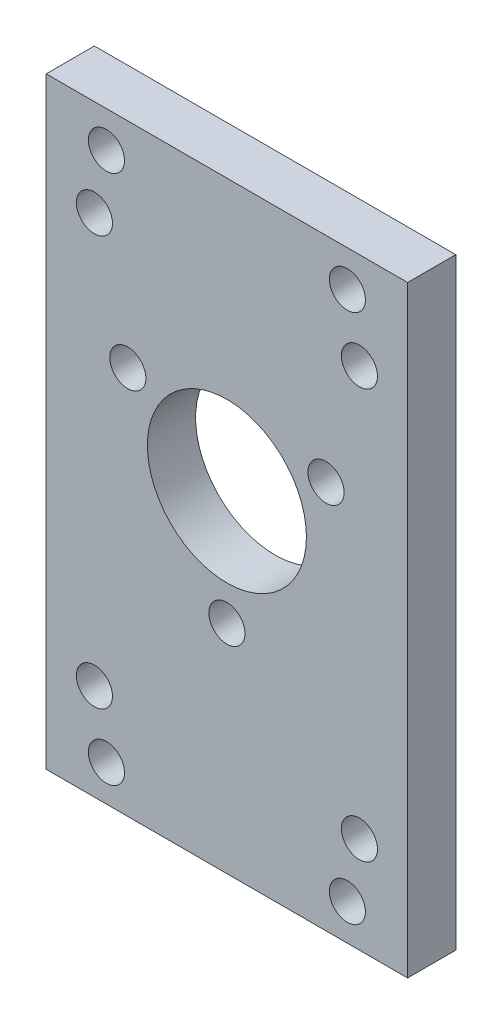
ISO-10303-21;
HEADER;
FILE_DESCRIPTION(('STEP AP214'),'2;1');
FILE_NAME('part.step','',(''),(''),'','','');
FILE_SCHEMA(('AUTOMOTIVE_DESIGN { 1 0 10303 214 1 1 1 1 }'));
ENDSEC;
DATA;
#1=APPLICATION_CONTEXT('core data for automotive mechanical design processes');
#2=APPLICATION_PROTOCOL_DEFINITION('international standard','automotive_design',2000,#1);
#3=PRODUCT_CONTEXT('',#1,'mechanical');
#4=PRODUCT('Part','Part','',(#3));
#5=PRODUCT_RELATED_PRODUCT_CATEGORY('part','',(#4));
#6=PRODUCT_DEFINITION_FORMATION('','',#4);
#7=PRODUCT_DEFINITION_CONTEXT('part definition',#1,'design');
#8=PRODUCT_DEFINITION('design','',#6,#7);
#9=PRODUCT_DEFINITION_SHAPE('','',#8);
#10=(LENGTH_UNIT() NAMED_UNIT(*) SI_UNIT(.MILLI.,.METRE.));
#11=(NAMED_UNIT(*) PLANE_ANGLE_UNIT() SI_UNIT($,.RADIAN.));
#12=(NAMED_UNIT(*) SI_UNIT($,.STERADIAN.) SOLID_ANGLE_UNIT());
#13=UNCERTAINTY_MEASURE_WITH_UNIT(LENGTH_MEASURE(1.E-05),#10,'distance_accuracy_value','');
#14=(GEOMETRIC_REPRESENTATION_CONTEXT(3) GLOBAL_UNCERTAINTY_ASSIGNED_CONTEXT((#13)) GLOBAL_UNIT_ASSIGNED_CONTEXT((#10,
#11,#12)) REPRESENTATION_CONTEXT('',''));
#15=CARTESIAN_POINT('',(0.,0.,0.));
#16=DIRECTION('',(0.,0.,1.));
#17=DIRECTION('',(1.,0.,0.));
#18=AXIS2_PLACEMENT_3D('',#15,#16,#17);
#19=CARTESIAN_POINT('',(0.,0.,4.));
#20=DIRECTION('',(0.,0.,-1.));
#21=DIRECTION('',(-1.,0.,0.));
#22=AXIS2_PLACEMENT_3D('',#19,#20,#21);
#23=PLANE('',#22);
#24=CARTESIAN_POINT('',(4.,42.,4.));
#25=DIRECTION('',(0.,0.,1.));
#26=DIRECTION('',(1.,0.,0.));
#27=AXIS2_PLACEMENT_3D('',#24,#25,#26);
#28=CIRCLE('',#27,1.5);
#29=CARTESIAN_POINT('',(5.5,42.,4.));
#30=VERTEX_POINT('',#29);
#31=EDGE_CURVE('E176',#30,#30,#28,.T.);
#32=ORIENTED_EDGE('',*,*,#31,.F.);
#33=EDGE_LOOP('',(#32));
#34=FACE_BOUND('',#33,.T.);
#35=CARTESIAN_POINT('',(26.,8.,4.));
#36=DIRECTION('',(0.,0.,1.));
#37=DIRECTION('',(1.,0.,0.));
#38=AXIS2_PLACEMENT_3D('',#35,#36,#37);
#39=CIRCLE('',#38,1.5);
#40=CARTESIAN_POINT('',(27.5,8.,4.));
#41=VERTEX_POINT('',#40);
#42=EDGE_CURVE('E169',#41,#41,#39,.T.);
#43=ORIENTED_EDGE('',*,*,#42,.F.);
#44=EDGE_LOOP('',(#43));
#45=FACE_BOUND('',#44,.T.);
#46=CARTESIAN_POINT('',(4.,8.,4.));
#47=DIRECTION('',(0.,0.,1.));
#48=DIRECTION('',(1.,0.,0.));
#49=AXIS2_PLACEMENT_3D('',#46,#47,#48);
#50=CIRCLE('',#49,1.5);
#51=CARTESIAN_POINT('',(5.50000000000001,8.,4.));
#52=VERTEX_POINT('',#51);
#53=EDGE_CURVE('E181',#52,#52,#50,.T.);
#54=ORIENTED_EDGE('',*,*,#53,.F.);
#55=EDGE_LOOP('',(#54));
#56=FACE_BOUND('',#55,.T.);
#57=CARTESIAN_POINT('',(26.,42.,4.));
#58=DIRECTION('',(0.,0.,1.));
#59=DIRECTION('',(1.,0.,0.));
#60=AXIS2_PLACEMENT_3D('',#57,#58,#59);
#61=CIRCLE('',#60,1.5);
#62=CARTESIAN_POINT('',(27.5,42.,4.));
#63=VERTEX_POINT('',#62);
#64=EDGE_CURVE('E163',#63,#63,#61,.T.);
#65=ORIENTED_EDGE('',*,*,#64,.F.);
#66=EDGE_LOOP('',(#65));
#67=FACE_BOUND('',#66,.T.);
#68=DIRECTION('',(0.,-1.,0.));
#69=VECTOR('',#68,1.);
#70=CARTESIAN_POINT('',(0.,0.,4.));
#71=LINE('',#70,#69);
#72=CARTESIAN_POINT('',(0.,50.,4.));
#73=VERTEX_POINT('',#72);
#74=CARTESIAN_POINT('',(0.,0.,4.));
#75=VERTEX_POINT('',#74);
#76=EDGE_CURVE('E88',#73,#75,#71,.T.);
#77=ORIENTED_EDGE('',*,*,#76,.T.);
#78=DIRECTION('',(1.,0.,0.));
#79=VECTOR('',#78,1.);
#80=CARTESIAN_POINT('',(0.,0.,4.));
#81=LINE('',#80,#79);
#82=CARTESIAN_POINT('',(30.,0.,4.));
#83=VERTEX_POINT('',#82);
#84=EDGE_CURVE('E83',#75,#83,#81,.T.);
#85=ORIENTED_EDGE('',*,*,#84,.T.);
#86=DIRECTION('',(0.,1.,0.));
#87=VECTOR('',#86,1.);
#88=CARTESIAN_POINT('',(30.,0.,4.));
#89=LINE('',#88,#87);
#90=CARTESIAN_POINT('',(30.,50.,4.));
#91=VERTEX_POINT('',#90);
#92=EDGE_CURVE('E86',#83,#91,#89,.T.);
#93=ORIENTED_EDGE('',*,*,#92,.T.);
#94=DIRECTION('',(-1.,0.,0.));
#95=VECTOR('',#94,1.);
#96=CARTESIAN_POINT('',(0.,50.,4.));
#97=LINE('',#96,#95);
#98=EDGE_CURVE('E53',#91,#73,#97,.T.);
#99=ORIENTED_EDGE('',*,*,#98,.T.);
#100=EDGE_LOOP('',(#77,#85,#93,#99));
#101=FACE_BOUND('',#100,.T.);
#102=CARTESIAN_POINT('',(15.,27.5,4.));
#103=DIRECTION('',(0.,0.,1.));
#104=DIRECTION('',(1.,0.,0.));
#105=AXIS2_PLACEMENT_3D('',#102,#103,#104);
#106=CIRCLE('',#105,6.6);
#107=CARTESIAN_POINT('',(21.6,27.5,4.));
#108=VERTEX_POINT('',#107);
#109=EDGE_CURVE('E103',#108,#108,#106,.T.);
#110=ORIENTED_EDGE('',*,*,#109,.F.);
#111=EDGE_LOOP('',(#110));
#112=FACE_BOUND('',#111,.T.);
#113=CARTESIAN_POINT('',(23.2272413359522,32.25,4.));
#114=DIRECTION('',(0.,0.,1.));
#115=DIRECTION('',(1.,0.,0.));
#116=AXIS2_PLACEMENT_3D('',#113,#114,#115);
#117=CIRCLE('',#116,1.5);
#118=CARTESIAN_POINT('',(24.7272413359522,32.25,4.));
#119=VERTEX_POINT('',#118);
#120=EDGE_CURVE('E118',#119,#119,#117,.T.);
#121=ORIENTED_EDGE('',*,*,#120,.F.);
#122=EDGE_LOOP('',(#121));
#123=FACE_BOUND('',#122,.T.);
#124=CARTESIAN_POINT('',(15.,18.,4.));
#125=DIRECTION('',(0.,0.,1.));
#126=DIRECTION('',(1.,0.,0.));
#127=AXIS2_PLACEMENT_3D('',#124,#125,#126);
#128=CIRCLE('',#127,1.5);
#129=CARTESIAN_POINT('',(16.5,18.,4.));
#130=VERTEX_POINT('',#129);
#131=EDGE_CURVE('E124',#130,#130,#128,.T.);
#132=ORIENTED_EDGE('',*,*,#131,.F.);
#133=EDGE_LOOP('',(#132));
#134=FACE_BOUND('',#133,.T.);
#135=CARTESIAN_POINT('',(6.77275866404785,32.25,4.));
#136=DIRECTION('',(0.,0.,1.));
#137=DIRECTION('',(1.,0.,0.));
#138=AXIS2_PLACEMENT_3D('',#135,#136,#137);
#139=CIRCLE('',#138,1.5);
#140=CARTESIAN_POINT('',(8.27275866404785,32.25,4.));
#141=VERTEX_POINT('',#140);
#142=EDGE_CURVE('E130',#141,#141,#139,.T.);
#143=ORIENTED_EDGE('',*,*,#142,.F.);
#144=EDGE_LOOP('',(#143));
#145=FACE_BOUND('',#144,.T.);
#146=CARTESIAN_POINT('',(5.,47.,4.));
#147=DIRECTION('',(0.,0.,1.));
#148=DIRECTION('',(1.,0.,0.));
#149=AXIS2_PLACEMENT_3D('',#146,#147,#148);
#150=CIRCLE('',#149,1.5);
#151=CARTESIAN_POINT('',(6.5,47.,4.));
#152=VERTEX_POINT('',#151);
#153=EDGE_CURVE('E136',#152,#152,#150,.T.);
#154=ORIENTED_EDGE('',*,*,#153,.F.);
#155=EDGE_LOOP('',(#154));
#156=FACE_BOUND('',#155,.T.);
#157=CARTESIAN_POINT('',(25.,47.,4.));
#158=DIRECTION('',(0.,0.,1.));
#159=DIRECTION('',(1.,0.,0.));
#160=AXIS2_PLACEMENT_3D('',#157,#158,#159);
#161=CIRCLE('',#160,1.5);
#162=CARTESIAN_POINT('',(26.5,47.,4.));
#163=VERTEX_POINT('',#162);
#164=EDGE_CURVE('E142',#163,#163,#161,.T.);
#165=ORIENTED_EDGE('',*,*,#164,.F.);
#166=EDGE_LOOP('',(#165));
#167=FACE_BOUND('',#166,.T.);
#168=CARTESIAN_POINT('',(5.,3.,4.));
#169=DIRECTION('',(0.,0.,1.));
#170=DIRECTION('',(1.,0.,0.));
#171=AXIS2_PLACEMENT_3D('',#168,#169,#170);
#172=CIRCLE('',#171,1.5);
#173=CARTESIAN_POINT('',(6.5,3.,4.));
#174=VERTEX_POINT('',#173);
#175=EDGE_CURVE('E148',#174,#174,#172,.T.);
#176=ORIENTED_EDGE('',*,*,#175,.F.);
#177=EDGE_LOOP('',(#176));
#178=FACE_BOUND('',#177,.T.);
#179=CARTESIAN_POINT('',(25.,3.,4.));
#180=DIRECTION('',(0.,0.,1.));
#181=DIRECTION('',(1.,0.,0.));
#182=AXIS2_PLACEMENT_3D('',#179,#180,#181);
#183=CIRCLE('',#182,1.5);
#184=CARTESIAN_POINT('',(26.5,3.,4.));
#185=VERTEX_POINT('',#184);
#186=EDGE_CURVE('E154',#185,#185,#183,.T.);
#187=ORIENTED_EDGE('',*,*,#186,.F.);
#188=EDGE_LOOP('',(#187));
#189=FACE_BOUND('',#188,.T.);
#190=ADVANCED_FACE('F36',(#34,#45,#56,#67,#101,#112,#123,#134,#145,#156,#167,#178,#189),#23,.F.);
#191=CARTESIAN_POINT('',(0.,0.,0.));
#192=DIRECTION('',(0.,0.,-1.));
#193=DIRECTION('',(-1.,0.,0.));
#194=AXIS2_PLACEMENT_3D('',#191,#192,#193);
#195=PLANE('',#194);
#196=CARTESIAN_POINT('',(4.,42.,0.));
#197=DIRECTION('',(0.,0.,1.));
#198=DIRECTION('',(1.,0.,0.));
#199=AXIS2_PLACEMENT_3D('',#196,#197,#198);
#200=CIRCLE('',#199,1.5);
#201=CARTESIAN_POINT('',(5.5,42.,0.));
#202=VERTEX_POINT('',#201);
#203=EDGE_CURVE('E166',#202,#202,#200,.T.);
#204=ORIENTED_EDGE('',*,*,#203,.T.);
#205=EDGE_LOOP('',(#204));
#206=FACE_BOUND('',#205,.T.);
#207=CARTESIAN_POINT('',(26.,8.,0.));
#208=DIRECTION('',(0.,0.,1.));
#209=DIRECTION('',(1.,0.,0.));
#210=AXIS2_PLACEMENT_3D('',#207,#208,#209);
#211=CIRCLE('',#210,1.5);
#212=CARTESIAN_POINT('',(27.5,8.,0.));
#213=VERTEX_POINT('',#212);
#214=EDGE_CURVE('E172',#213,#213,#211,.T.);
#215=ORIENTED_EDGE('',*,*,#214,.T.);
#216=EDGE_LOOP('',(#215));
#217=FACE_BOUND('',#216,.T.);
#218=CARTESIAN_POINT('',(4.,8.,0.));
#219=DIRECTION('',(0.,0.,1.));
#220=DIRECTION('',(1.,0.,0.));
#221=AXIS2_PLACEMENT_3D('',#218,#219,#220);
#222=CIRCLE('',#221,1.5);
#223=CARTESIAN_POINT('',(5.50000000000001,8.,0.));
#224=VERTEX_POINT('',#223);
#225=EDGE_CURVE('E173',#224,#224,#222,.T.);
#226=ORIENTED_EDGE('',*,*,#225,.T.);
#227=EDGE_LOOP('',(#226));
#228=FACE_BOUND('',#227,.T.);
#229=CARTESIAN_POINT('',(26.,42.,0.));
#230=DIRECTION('',(0.,0.,1.));
#231=DIRECTION('',(1.,0.,0.));
#232=AXIS2_PLACEMENT_3D('',#229,#230,#231);
#233=CIRCLE('',#232,1.5);
#234=CARTESIAN_POINT('',(27.5,42.,0.));
#235=VERTEX_POINT('',#234);
#236=EDGE_CURVE('E160',#235,#235,#233,.T.);
#237=ORIENTED_EDGE('',*,*,#236,.T.);
#238=EDGE_LOOP('',(#237));
#239=FACE_BOUND('',#238,.T.);
#240=CARTESIAN_POINT('',(5.,3.,0.));
#241=DIRECTION('',(0.,0.,1.));
#242=DIRECTION('',(1.,0.,0.));
#243=AXIS2_PLACEMENT_3D('',#240,#241,#242);
#244=CIRCLE('',#243,1.5);
#245=CARTESIAN_POINT('',(6.5,3.,0.));
#246=VERTEX_POINT('',#245);
#247=EDGE_CURVE('E151',#246,#246,#244,.T.);
#248=ORIENTED_EDGE('',*,*,#247,.T.);
#249=EDGE_LOOP('',(#248));
#250=FACE_BOUND('',#249,.T.);
#251=CARTESIAN_POINT('',(5.,47.,0.));
#252=DIRECTION('',(0.,0.,1.));
#253=DIRECTION('',(1.,0.,0.));
#254=AXIS2_PLACEMENT_3D('',#251,#252,#253);
#255=CIRCLE('',#254,1.5);
#256=CARTESIAN_POINT('',(6.5,47.,0.));
#257=VERTEX_POINT('',#256);
#258=EDGE_CURVE('E139',#257,#257,#255,.T.);
#259=ORIENTED_EDGE('',*,*,#258,.T.);
#260=EDGE_LOOP('',(#259));
#261=FACE_BOUND('',#260,.T.);
#262=CARTESIAN_POINT('',(15.,18.,0.));
#263=DIRECTION('',(0.,0.,1.));
#264=DIRECTION('',(1.,0.,0.));
#265=AXIS2_PLACEMENT_3D('',#262,#263,#264);
#266=CIRCLE('',#265,1.5);
#267=CARTESIAN_POINT('',(16.5,18.,0.));
#268=VERTEX_POINT('',#267);
#269=EDGE_CURVE('E127',#268,#268,#266,.T.);
#270=ORIENTED_EDGE('',*,*,#269,.T.);
#271=EDGE_LOOP('',(#270));
#272=FACE_BOUND('',#271,.T.);
#273=CARTESIAN_POINT('',(15.,27.5,0.));
#274=DIRECTION('',(0.,0.,1.));
#275=DIRECTION('',(1.,0.,0.));
#276=AXIS2_PLACEMENT_3D('',#273,#274,#275);
#277=CIRCLE('',#276,6.6);
#278=CARTESIAN_POINT('',(21.6,27.5,0.));
#279=VERTEX_POINT('',#278);
#280=EDGE_CURVE('E115',#279,#279,#277,.T.);
#281=ORIENTED_EDGE('',*,*,#280,.T.);
#282=EDGE_LOOP('',(#281));
#283=FACE_BOUND('',#282,.T.);
#284=DIRECTION('',(0.,-1.,0.));
#285=VECTOR('',#284,1.);
#286=CARTESIAN_POINT('',(0.,0.,0.));
#287=LINE('',#286,#285);
#288=CARTESIAN_POINT('',(0.,50.,0.));
#289=VERTEX_POINT('',#288);
#290=CARTESIAN_POINT('',(0.,0.,0.));
#291=VERTEX_POINT('',#290);
#292=EDGE_CURVE('E100',#289,#291,#287,.T.);
#293=ORIENTED_EDGE('',*,*,#292,.F.);
#294=DIRECTION('',(-1.,0.,0.));
#295=VECTOR('',#294,1.);
#296=CARTESIAN_POINT('',(0.,50.,0.));
#297=LINE('',#296,#295);
#298=CARTESIAN_POINT('',(30.,50.,0.));
#299=VERTEX_POINT('',#298);
#300=EDGE_CURVE('E76',#299,#289,#297,.T.);
#301=ORIENTED_EDGE('',*,*,#300,.F.);
#302=DIRECTION('',(0.,1.,0.));
#303=VECTOR('',#302,1.);
#304=CARTESIAN_POINT('',(30.,0.,0.));
#305=LINE('',#304,#303);
#306=CARTESIAN_POINT('',(30.,0.,0.));
#307=VERTEX_POINT('',#306);
#308=EDGE_CURVE('E70',#307,#299,#305,.T.);
#309=ORIENTED_EDGE('',*,*,#308,.F.);
#310=DIRECTION('',(1.,0.,0.));
#311=VECTOR('',#310,1.);
#312=CARTESIAN_POINT('',(0.,0.,0.));
#313=LINE('',#312,#311);
#314=EDGE_CURVE('E92',#291,#307,#313,.T.);
#315=ORIENTED_EDGE('',*,*,#314,.F.);
#316=EDGE_LOOP('',(#293,#301,#309,#315));
#317=FACE_BOUND('',#316,.T.);
#318=CARTESIAN_POINT('',(23.2272413359522,32.25,0.));
#319=DIRECTION('',(0.,0.,1.));
#320=DIRECTION('',(1.,0.,0.));
#321=AXIS2_PLACEMENT_3D('',#318,#319,#320);
#322=CIRCLE('',#321,1.5);
#323=CARTESIAN_POINT('',(24.7272413359522,32.25,0.));
#324=VERTEX_POINT('',#323);
#325=EDGE_CURVE('E121',#324,#324,#322,.T.);
#326=ORIENTED_EDGE('',*,*,#325,.T.);
#327=EDGE_LOOP('',(#326));
#328=FACE_BOUND('',#327,.T.);
#329=CARTESIAN_POINT('',(6.77275866404785,32.25,0.));
#330=DIRECTION('',(0.,0.,1.));
#331=DIRECTION('',(1.,0.,0.));
#332=AXIS2_PLACEMENT_3D('',#329,#330,#331);
#333=CIRCLE('',#332,1.5);
#334=CARTESIAN_POINT('',(8.27275866404785,32.25,0.));
#335=VERTEX_POINT('',#334);
#336=EDGE_CURVE('E133',#335,#335,#333,.T.);
#337=ORIENTED_EDGE('',*,*,#336,.T.);
#338=EDGE_LOOP('',(#337));
#339=FACE_BOUND('',#338,.T.);
#340=CARTESIAN_POINT('',(25.,47.,0.));
#341=DIRECTION('',(0.,0.,1.));
#342=DIRECTION('',(1.,0.,0.));
#343=AXIS2_PLACEMENT_3D('',#340,#341,#342);
#344=CIRCLE('',#343,1.5);
#345=CARTESIAN_POINT('',(26.5,47.,0.));
#346=VERTEX_POINT('',#345);
#347=EDGE_CURVE('E145',#346,#346,#344,.T.);
#348=ORIENTED_EDGE('',*,*,#347,.T.);
#349=EDGE_LOOP('',(#348));
#350=FACE_BOUND('',#349,.T.);
#351=CARTESIAN_POINT('',(25.,3.,0.));
#352=DIRECTION('',(0.,0.,1.));
#353=DIRECTION('',(1.,0.,0.));
#354=AXIS2_PLACEMENT_3D('',#351,#352,#353);
#355=CIRCLE('',#354,1.5);
#356=CARTESIAN_POINT('',(26.5,3.,0.));
#357=VERTEX_POINT('',#356);
#358=EDGE_CURVE('E157',#357,#357,#355,.T.);
#359=ORIENTED_EDGE('',*,*,#358,.T.);
#360=EDGE_LOOP('',(#359));
#361=FACE_BOUND('',#360,.T.);
#362=ADVANCED_FACE('F111',(#206,#217,#228,#239,#250,#261,#272,#283,#317,#328,#339,#350,#361),
#195,.T.);
#363=CARTESIAN_POINT('',(0.,0.,4.));
#364=DIRECTION('',(1.,0.,0.));
#365=DIRECTION('',(0.,0.,-1.));
#366=AXIS2_PLACEMENT_3D('',#363,#364,#365);
#367=PLANE('',#366);
#368=ORIENTED_EDGE('',*,*,#292,.T.);
#369=DIRECTION('',(0.,0.,-1.));
#370=VECTOR('',#369,1.);
#371=CARTESIAN_POINT('',(0.,0.,4.));
#372=LINE('',#371,#370);
#373=EDGE_CURVE('E11',#75,#291,#372,.T.);
#374=ORIENTED_EDGE('',*,*,#373,.F.);
#375=ORIENTED_EDGE('',*,*,#76,.F.);
#376=DIRECTION('',(0.,0.,-1.));
#377=VECTOR('',#376,1.);
#378=CARTESIAN_POINT('',(0.,50.,4.));
#379=LINE('',#378,#377);
#380=EDGE_CURVE('E96',#73,#289,#379,.T.);
#381=ORIENTED_EDGE('',*,*,#380,.T.);
#382=EDGE_LOOP('',(#368,#374,#375,#381));
#383=FACE_BOUND('',#382,.T.);
#384=ADVANCED_FACE('F38',(#383),#367,.F.);
#385=CARTESIAN_POINT('',(0.,0.,4.));
#386=DIRECTION('',(0.,1.,0.));
#387=DIRECTION('',(-1.,0.,0.));
#388=AXIS2_PLACEMENT_3D('',#385,#386,#387);
#389=PLANE('',#388);
#390=ORIENTED_EDGE('',*,*,#314,.T.);
#391=DIRECTION('',(0.,0.,-1.));
#392=VECTOR('',#391,1.);
#393=CARTESIAN_POINT('',(30.,0.,4.));
#394=LINE('',#393,#392);
#395=EDGE_CURVE('E45',#83,#307,#394,.T.);
#396=ORIENTED_EDGE('',*,*,#395,.F.);
#397=ORIENTED_EDGE('',*,*,#84,.F.);
#398=ORIENTED_EDGE('',*,*,#373,.T.);
#399=EDGE_LOOP('',(#390,#396,#397,#398));
#400=FACE_BOUND('',#399,.T.);
#401=ADVANCED_FACE('F91',(#400),#389,.F.);
#402=CARTESIAN_POINT('',(30.,0.,4.));
#403=DIRECTION('',(-1.,0.,0.));
#404=DIRECTION('',(0.,-1.,0.));
#405=AXIS2_PLACEMENT_3D('',#402,#403,#404);
#406=PLANE('',#405);
#407=ORIENTED_EDGE('',*,*,#308,.T.);
#408=DIRECTION('',(0.,0.,-1.));
#409=VECTOR('',#408,1.);
#410=CARTESIAN_POINT('',(30.,50.,4.));
#411=LINE('',#410,#409);
#412=EDGE_CURVE('E93',#91,#299,#411,.T.);
#413=ORIENTED_EDGE('',*,*,#412,.F.);
#414=ORIENTED_EDGE('',*,*,#92,.F.);
#415=ORIENTED_EDGE('',*,*,#395,.T.);
#416=EDGE_LOOP('',(#407,#413,#414,#415));
#417=FACE_BOUND('',#416,.T.);
#418=ADVANCED_FACE('F94',(#417),#406,.F.);
#419=CARTESIAN_POINT('',(0.,50.,4.));
#420=DIRECTION('',(0.,-1.,0.));
#421=DIRECTION('',(1.,0.,0.));
#422=AXIS2_PLACEMENT_3D('',#419,#420,#421);
#423=PLANE('',#422);
#424=ORIENTED_EDGE('',*,*,#300,.T.);
#425=ORIENTED_EDGE('',*,*,#380,.F.);
#426=ORIENTED_EDGE('',*,*,#98,.F.);
#427=ORIENTED_EDGE('',*,*,#412,.T.);
#428=EDGE_LOOP('',(#424,#425,#426,#427));
#429=FACE_BOUND('',#428,.T.);
#430=ADVANCED_FACE('F108',(#429),#423,.F.);
#431=CARTESIAN_POINT('',(15.,27.5,4.));
#432=DIRECTION('',(0.,0.,-1.));
#433=DIRECTION('',(-1.,0.,0.));
#434=AXIS2_PLACEMENT_3D('',#431,#432,#433);
#435=CYLINDRICAL_SURFACE('',#434,6.6);
#436=ORIENTED_EDGE('',*,*,#109,.T.);
#437=EDGE_LOOP('',(#436));
#438=FACE_BOUND('',#437,.T.);
#439=ORIENTED_EDGE('',*,*,#280,.F.);
#440=EDGE_LOOP('',(#439));
#441=FACE_BOUND('',#440,.T.);
#442=ADVANCED_FACE('F239',(#438,#441),#435,.F.);
#443=CARTESIAN_POINT('',(23.2272413359522,32.25,4.));
#444=DIRECTION('',(0.,0.,-1.));
#445=DIRECTION('',(-1.,0.,0.));
#446=AXIS2_PLACEMENT_3D('',#443,#444,#445);
#447=CYLINDRICAL_SURFACE('',#446,1.5);
#448=ORIENTED_EDGE('',*,*,#120,.T.);
#449=EDGE_LOOP('',(#448));
#450=FACE_BOUND('',#449,.T.);
#451=ORIENTED_EDGE('',*,*,#325,.F.);
#452=EDGE_LOOP('',(#451));
#453=FACE_BOUND('',#452,.T.);
#454=ADVANCED_FACE('F235',(#450,#453),#447,.F.);
#455=CARTESIAN_POINT('',(15.,18.,4.));
#456=DIRECTION('',(0.,0.,-1.));
#457=DIRECTION('',(-1.,0.,0.));
#458=AXIS2_PLACEMENT_3D('',#455,#456,#457);
#459=CYLINDRICAL_SURFACE('',#458,1.5);
#460=ORIENTED_EDGE('',*,*,#131,.T.);
#461=EDGE_LOOP('',(#460));
#462=FACE_BOUND('',#461,.T.);
#463=ORIENTED_EDGE('',*,*,#269,.F.);
#464=EDGE_LOOP('',(#463));
#465=FACE_BOUND('',#464,.T.);
#466=ADVANCED_FACE('F231',(#462,#465),#459,.F.);
#467=CARTESIAN_POINT('',(6.77275866404785,32.25,4.));
#468=DIRECTION('',(0.,0.,-1.));
#469=DIRECTION('',(-1.,0.,0.));
#470=AXIS2_PLACEMENT_3D('',#467,#468,#469);
#471=CYLINDRICAL_SURFACE('',#470,1.5);
#472=ORIENTED_EDGE('',*,*,#142,.T.);
#473=EDGE_LOOP('',(#472));
#474=FACE_BOUND('',#473,.T.);
#475=ORIENTED_EDGE('',*,*,#336,.F.);
#476=EDGE_LOOP('',(#475));
#477=FACE_BOUND('',#476,.T.);
#478=ADVANCED_FACE('F227',(#474,#477),#471,.F.);
#479=CARTESIAN_POINT('',(5.,47.,4.));
#480=DIRECTION('',(0.,0.,-1.));
#481=DIRECTION('',(-1.,0.,0.));
#482=AXIS2_PLACEMENT_3D('',#479,#480,#481);
#483=CYLINDRICAL_SURFACE('',#482,1.5);
#484=ORIENTED_EDGE('',*,*,#153,.T.);
#485=EDGE_LOOP('',(#484));
#486=FACE_BOUND('',#485,.T.);
#487=ORIENTED_EDGE('',*,*,#258,.F.);
#488=EDGE_LOOP('',(#487));
#489=FACE_BOUND('',#488,.T.);
#490=ADVANCED_FACE('F223',(#486,#489),#483,.F.);
#491=CARTESIAN_POINT('',(25.,47.,4.));
#492=DIRECTION('',(0.,0.,-1.));
#493=DIRECTION('',(-1.,0.,0.));
#494=AXIS2_PLACEMENT_3D('',#491,#492,#493);
#495=CYLINDRICAL_SURFACE('',#494,1.5);
#496=ORIENTED_EDGE('',*,*,#164,.T.);
#497=EDGE_LOOP('',(#496));
#498=FACE_BOUND('',#497,.T.);
#499=ORIENTED_EDGE('',*,*,#347,.F.);
#500=EDGE_LOOP('',(#499));
#501=FACE_BOUND('',#500,.T.);
#502=ADVANCED_FACE('F219',(#498,#501),#495,.F.);
#503=CARTESIAN_POINT('',(5.,3.,4.));
#504=DIRECTION('',(0.,0.,-1.));
#505=DIRECTION('',(-1.,0.,0.));
#506=AXIS2_PLACEMENT_3D('',#503,#504,#505);
#507=CYLINDRICAL_SURFACE('',#506,1.5);
#508=ORIENTED_EDGE('',*,*,#175,.T.);
#509=EDGE_LOOP('',(#508));
#510=FACE_BOUND('',#509,.T.);
#511=ORIENTED_EDGE('',*,*,#247,.F.);
#512=EDGE_LOOP('',(#511));
#513=FACE_BOUND('',#512,.T.);
#514=ADVANCED_FACE('F210',(#510,#513),#507,.F.);
#515=CARTESIAN_POINT('',(25.,3.,4.));
#516=DIRECTION('',(0.,0.,-1.));
#517=DIRECTION('',(-1.,0.,0.));
#518=AXIS2_PLACEMENT_3D('',#515,#516,#517);
#519=CYLINDRICAL_SURFACE('',#518,1.5);
#520=ORIENTED_EDGE('',*,*,#186,.T.);
#521=EDGE_LOOP('',(#520));
#522=FACE_BOUND('',#521,.T.);
#523=ORIENTED_EDGE('',*,*,#358,.F.);
#524=EDGE_LOOP('',(#523));
#525=FACE_BOUND('',#524,.T.);
#526=ADVANCED_FACE('F204',(#522,#525),#519,.F.);
#527=CARTESIAN_POINT('',(26.,42.,0.));
#528=DIRECTION('',(0.,0.,1.));
#529=DIRECTION('',(1.,0.,0.));
#530=AXIS2_PLACEMENT_3D('',#527,#528,#529);
#531=CYLINDRICAL_SURFACE('',#530,1.5);
#532=ORIENTED_EDGE('',*,*,#236,.F.);
#533=EDGE_LOOP('',(#532));
#534=FACE_BOUND('',#533,.T.);
#535=ORIENTED_EDGE('',*,*,#64,.T.);
#536=EDGE_LOOP('',(#535));
#537=FACE_BOUND('',#536,.T.);
#538=ADVANCED_FACE('F193',(#534,#537),#531,.F.);
#539=CARTESIAN_POINT('',(4.,8.,0.));
#540=DIRECTION('',(0.,0.,1.));
#541=DIRECTION('',(1.,0.,0.));
#542=AXIS2_PLACEMENT_3D('',#539,#540,#541);
#543=CYLINDRICAL_SURFACE('',#542,1.5);
#544=ORIENTED_EDGE('',*,*,#225,.F.);
#545=EDGE_LOOP('',(#544));
#546=FACE_BOUND('',#545,.T.);
#547=ORIENTED_EDGE('',*,*,#53,.T.);
#548=EDGE_LOOP('',(#547));
#549=FACE_BOUND('',#548,.T.);
#550=ADVANCED_FACE('F189',(#546,#549),#543,.F.);
#551=CARTESIAN_POINT('',(26.,8.,0.));
#552=DIRECTION('',(0.,0.,1.));
#553=DIRECTION('',(1.,0.,0.));
#554=AXIS2_PLACEMENT_3D('',#551,#552,#553);
#555=CYLINDRICAL_SURFACE('',#554,1.5);
#556=ORIENTED_EDGE('',*,*,#214,.F.);
#557=EDGE_LOOP('',(#556));
#558=FACE_BOUND('',#557,.T.);
#559=ORIENTED_EDGE('',*,*,#42,.T.);
#560=EDGE_LOOP('',(#559));
#561=FACE_BOUND('',#560,.T.);
#562=ADVANCED_FACE('F192',(#558,#561),#555,.F.);
#563=CARTESIAN_POINT('',(4.,42.,0.));
#564=DIRECTION('',(0.,0.,1.));
#565=DIRECTION('',(1.,0.,0.));
#566=AXIS2_PLACEMENT_3D('',#563,#564,#565);
#567=CYLINDRICAL_SURFACE('',#566,1.5);
#568=ORIENTED_EDGE('',*,*,#203,.F.);
#569=EDGE_LOOP('',(#568));
#570=FACE_BOUND('',#569,.T.);
#571=ORIENTED_EDGE('',*,*,#31,.T.);
#572=EDGE_LOOP('',(#571));
#573=FACE_BOUND('',#572,.T.);
#574=ADVANCED_FACE('F351',(#570,#573),#567,.F.);
#575=CLOSED_SHELL('',(#190,#362,#384,#401,#418,#430,#442,#454,#466,#478,#490,#502,#514,#526,
#538,#550,#562,#574));
#576=MANIFOLD_SOLID_BREP('B2',#575);
#577=ADVANCED_BREP_SHAPE_REPRESENTATION('',(#18,#576),#14);
#578=SHAPE_DEFINITION_REPRESENTATION(#9,#577);
ENDSEC;
END-ISO-10303-21;
